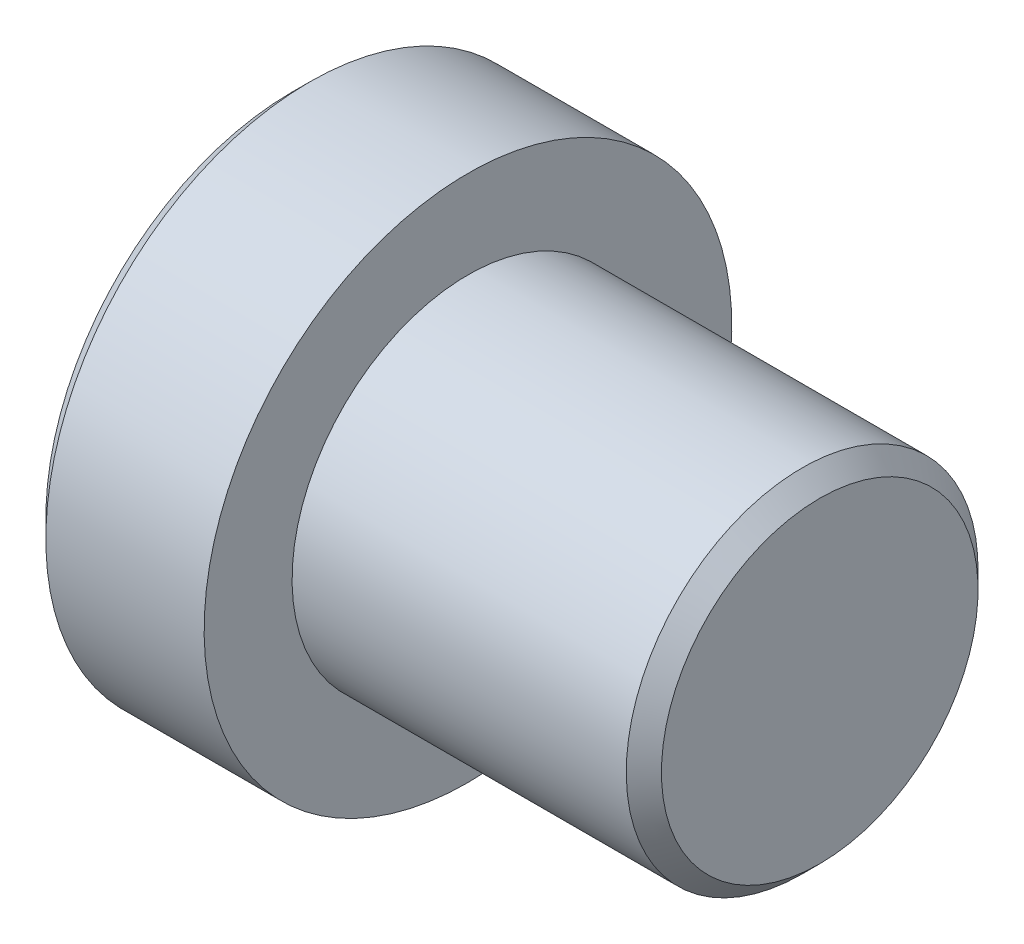
ISO-10303-21;
HEADER;
FILE_DESCRIPTION(('STEP AP214'),'2;1');
FILE_NAME('part.step','',(''),(''),'','','');
FILE_SCHEMA(('AUTOMOTIVE_DESIGN { 1 0 10303 214 1 1 1 1 }'));
ENDSEC;
DATA;
#1=APPLICATION_CONTEXT('core data for automotive mechanical design processes');
#2=APPLICATION_PROTOCOL_DEFINITION('international standard','automotive_design',2000,#1);
#3=PRODUCT_CONTEXT('',#1,'mechanical');
#4=PRODUCT('Part','Part','',(#3));
#5=PRODUCT_RELATED_PRODUCT_CATEGORY('part','',(#4));
#6=PRODUCT_DEFINITION_FORMATION('','',#4);
#7=PRODUCT_DEFINITION_CONTEXT('part definition',#1,'design');
#8=PRODUCT_DEFINITION('design','',#6,#7);
#9=PRODUCT_DEFINITION_SHAPE('','',#8);
#10=(LENGTH_UNIT() NAMED_UNIT(*) SI_UNIT(.MILLI.,.METRE.));
#11=(NAMED_UNIT(*) PLANE_ANGLE_UNIT() SI_UNIT($,.RADIAN.));
#12=(NAMED_UNIT(*) SI_UNIT($,.STERADIAN.) SOLID_ANGLE_UNIT());
#13=UNCERTAINTY_MEASURE_WITH_UNIT(LENGTH_MEASURE(1.E-05),#10,'distance_accuracy_value','');
#14=(GEOMETRIC_REPRESENTATION_CONTEXT(3) GLOBAL_UNCERTAINTY_ASSIGNED_CONTEXT((#13)) GLOBAL_UNIT_ASSIGNED_CONTEXT((#10,
#11,#12)) REPRESENTATION_CONTEXT('',''));
#15=CARTESIAN_POINT('',(0.,0.,0.));
#16=DIRECTION('',(0.,0.,1.));
#17=DIRECTION('',(1.,0.,0.));
#18=AXIS2_PLACEMENT_3D('',#15,#16,#17);
#19=CARTESIAN_POINT('',(0.,0.,0.));
#20=DIRECTION('',(1.,0.,0.));
#21=DIRECTION('',(0.,1.,0.));
#22=AXIS2_PLACEMENT_3D('',#19,#20,#21);
#23=PLANE('',#22);
#24=CARTESIAN_POINT('',(0.,0.,0.));
#25=DIRECTION('',(1.,0.,0.));
#26=DIRECTION('',(0.,1.,0.));
#27=AXIS2_PLACEMENT_3D('',#24,#25,#26);
#28=CIRCLE('',#27,2.8);
#29=CARTESIAN_POINT('',(0.,2.8,0.));
#30=VERTEX_POINT('',#29);
#31=EDGE_CURVE('E58',#30,#30,#28,.F.);
#32=ORIENTED_EDGE('',*,*,#31,.T.);
#33=EDGE_LOOP('',(#32));
#34=FACE_BOUND('',#33,.T.);
#35=DIRECTION('',(0.,-0.5,-0.866025403784439));
#36=VECTOR('',#35,1.);
#37=CARTESIAN_POINT('',(0.,2.,0.));
#38=LINE('',#37,#36);
#39=CARTESIAN_POINT('',(0.,2.,0.));
#40=VERTEX_POINT('',#39);
#41=CARTESIAN_POINT('',(0.,0.999999999999999,-1.73205080756888));
#42=VERTEX_POINT('',#41);
#43=EDGE_CURVE('E139',#40,#42,#38,.T.);
#44=ORIENTED_EDGE('',*,*,#43,.F.);
#45=DIRECTION('',(0.,0.5,-0.866025403784439));
#46=VECTOR('',#45,1.);
#47=CARTESIAN_POINT('',(0.,1.,1.73205080756887));
#48=LINE('',#47,#46);
#49=CARTESIAN_POINT('',(0.,1.,1.73205080756887));
#50=VERTEX_POINT('',#49);
#51=EDGE_CURVE('E65',#50,#40,#48,.T.);
#52=ORIENTED_EDGE('',*,*,#51,.F.);
#53=DIRECTION('',(0.,1.,0.));
#54=VECTOR('',#53,1.);
#55=CARTESIAN_POINT('',(0.,-0.999999999999999,1.73205080756887));
#56=LINE('',#55,#54);
#57=CARTESIAN_POINT('',(0.,-0.999999999999999,1.73205080756887));
#58=VERTEX_POINT('',#57);
#59=EDGE_CURVE('E148',#58,#50,#56,.T.);
#60=ORIENTED_EDGE('',*,*,#59,.F.);
#61=DIRECTION('',(0.,0.5,0.866025403784439));
#62=VECTOR('',#61,1.);
#63=CARTESIAN_POINT('',(0.,-2.,0.));
#64=LINE('',#63,#62);
#65=CARTESIAN_POINT('',(0.,-2.,0.));
#66=VERTEX_POINT('',#65);
#67=EDGE_CURVE('E146',#66,#58,#64,.T.);
#68=ORIENTED_EDGE('',*,*,#67,.F.);
#69=DIRECTION('',(0.,-0.5,0.866025403784439));
#70=VECTOR('',#69,1.);
#71=CARTESIAN_POINT('',(0.,-0.999999999999999,-1.73205080756888));
#72=LINE('',#71,#70);
#73=CARTESIAN_POINT('',(0.,-0.999999999999999,-1.73205080756888));
#74=VERTEX_POINT('',#73);
#75=EDGE_CURVE('E113',#74,#66,#72,.T.);
#76=ORIENTED_EDGE('',*,*,#75,.F.);
#77=DIRECTION('',(0.,-1.,0.));
#78=VECTOR('',#77,1.);
#79=CARTESIAN_POINT('',(0.,0.999999999999999,-1.73205080756888));
#80=LINE('',#79,#78);
#81=EDGE_CURVE('E142',#42,#74,#80,.T.);
#82=ORIENTED_EDGE('',*,*,#81,.F.);
#83=EDGE_LOOP('',(#44,#52,#60,#68,#76,#82));
#84=FACE_BOUND('',#83,.T.);
#85=ADVANCED_FACE('F49',(#34,#84),#23,.F.);
#86=CARTESIAN_POINT('',(0.,0.,0.));
#87=DIRECTION('',(-1.,0.,0.));
#88=DIRECTION('',(0.,-1.,0.));
#89=AXIS2_PLACEMENT_3D('',#86,#87,#88);
#90=CYLINDRICAL_SURFACE('',#89,3.);
#91=CARTESIAN_POINT('',(0.199999999999999,0.,0.));
#92=DIRECTION('',(1.,0.,0.));
#93=DIRECTION('',(0.,1.,0.));
#94=AXIS2_PLACEMENT_3D('',#91,#92,#93);
#95=CIRCLE('',#94,3.);
#96=CARTESIAN_POINT('',(0.199999999999999,3.,0.));
#97=VERTEX_POINT('',#96);
#98=EDGE_CURVE('E11',#97,#97,#95,.T.);
#99=ORIENTED_EDGE('',*,*,#98,.T.);
#100=EDGE_LOOP('',(#99));
#101=FACE_BOUND('',#100,.T.);
#102=CARTESIAN_POINT('',(2.,0.,0.));
#103=DIRECTION('',(-1.,0.,0.));
#104=DIRECTION('',(0.,-1.,0.));
#105=AXIS2_PLACEMENT_3D('',#102,#103,#104);
#106=CIRCLE('',#105,3.);
#107=CARTESIAN_POINT('',(2.,-3.,0.));
#108=VERTEX_POINT('',#107);
#109=EDGE_CURVE('E160',#108,#108,#106,.T.);
#110=ORIENTED_EDGE('',*,*,#109,.T.);
#111=EDGE_LOOP('',(#110));
#112=FACE_BOUND('',#111,.T.);
#113=ADVANCED_FACE('F183',(#101,#112),#90,.T.);
#114=CARTESIAN_POINT('',(2.,3.,0.));
#115=DIRECTION('',(-1.,0.,0.));
#116=DIRECTION('',(0.,-1.,0.));
#117=AXIS2_PLACEMENT_3D('',#114,#115,#116);
#118=PLANE('',#117);
#119=ORIENTED_EDGE('',*,*,#109,.F.);
#120=EDGE_LOOP('',(#119));
#121=FACE_BOUND('',#120,.T.);
#122=CARTESIAN_POINT('',(2.,0.,0.));
#123=DIRECTION('',(-1.,0.,0.));
#124=DIRECTION('',(0.,-1.,0.));
#125=AXIS2_PLACEMENT_3D('',#122,#123,#124);
#126=CIRCLE('',#125,2.);
#127=CARTESIAN_POINT('',(2.,-2.,0.));
#128=VERTEX_POINT('',#127);
#129=EDGE_CURVE('E152',#128,#128,#126,.T.);
#130=ORIENTED_EDGE('',*,*,#129,.T.);
#131=EDGE_LOOP('',(#130));
#132=FACE_BOUND('',#131,.T.);
#133=ADVANCED_FACE('F190',(#121,#132),#118,.F.);
#134=CARTESIAN_POINT('',(0.,0.,0.));
#135=DIRECTION('',(-1.,0.,0.));
#136=DIRECTION('',(0.,-1.,0.));
#137=AXIS2_PLACEMENT_3D('',#134,#135,#136);
#138=CYLINDRICAL_SURFACE('',#137,2.);
#139=CARTESIAN_POINT('',(5.8,0.,0.));
#140=DIRECTION('',(-1.,0.,0.));
#141=DIRECTION('',(0.,-1.,0.));
#142=AXIS2_PLACEMENT_3D('',#139,#140,#141);
#143=CIRCLE('',#142,2.);
#144=CARTESIAN_POINT('',(5.8,-2.,0.));
#145=VERTEX_POINT('',#144);
#146=EDGE_CURVE('E163',#145,#145,#143,.T.);
#147=ORIENTED_EDGE('',*,*,#146,.T.);
#148=EDGE_LOOP('',(#147));
#149=FACE_BOUND('',#148,.T.);
#150=ORIENTED_EDGE('',*,*,#129,.F.);
#151=EDGE_LOOP('',(#150));
#152=FACE_BOUND('',#151,.T.);
#153=ADVANCED_FACE('F201',(#149,#152),#138,.T.);
#154=CARTESIAN_POINT('',(6.,2.,0.));
#155=DIRECTION('',(-1.,0.,0.));
#156=DIRECTION('',(0.,-1.,0.));
#157=AXIS2_PLACEMENT_3D('',#154,#155,#156);
#158=PLANE('',#157);
#159=CARTESIAN_POINT('',(6.,0.,0.));
#160=DIRECTION('',(-1.,0.,0.));
#161=DIRECTION('',(0.,-1.,0.));
#162=AXIS2_PLACEMENT_3D('',#159,#160,#161);
#163=CIRCLE('',#162,1.8);
#164=CARTESIAN_POINT('',(6.,-1.8,0.));
#165=VERTEX_POINT('',#164);
#166=EDGE_CURVE('E166',#165,#165,#163,.F.);
#167=ORIENTED_EDGE('',*,*,#166,.T.);
#168=EDGE_LOOP('',(#167));
#169=FACE_BOUND('',#168,.T.);
#170=ADVANCED_FACE('F205',(#169),#158,.F.);
#171=CARTESIAN_POINT('',(1.5,1.,1.73205080756887));
#172=DIRECTION('',(0.,0.866025403784439,0.5));
#173=DIRECTION('',(0.,-0.5,0.866025403784439));
#174=AXIS2_PLACEMENT_3D('',#171,#172,#173);
#175=PLANE('',#174);
#176=ORIENTED_EDGE('',*,*,#51,.T.);
#177=DIRECTION('',(-1.,0.,0.));
#178=VECTOR('',#177,1.);
#179=CARTESIAN_POINT('',(1.5,2.,0.));
#180=LINE('',#179,#178);
#181=CARTESIAN_POINT('',(1.5,2.,0.));
#182=VERTEX_POINT('',#181);
#183=EDGE_CURVE('E95',#182,#40,#180,.T.);
#184=ORIENTED_EDGE('',*,*,#183,.F.);
#185=DIRECTION('',(0.,0.5,-0.866025403784439));
#186=VECTOR('',#185,1.);
#187=CARTESIAN_POINT('',(1.5,1.,1.73205080756887));
#188=LINE('',#187,#186);
#189=CARTESIAN_POINT('',(1.5,1.,1.73205080756887));
#190=VERTEX_POINT('',#189);
#191=EDGE_CURVE('E150',#190,#182,#188,.T.);
#192=ORIENTED_EDGE('',*,*,#191,.F.);
#193=DIRECTION('',(-1.,0.,0.));
#194=VECTOR('',#193,1.);
#195=CARTESIAN_POINT('',(1.5,1.,1.73205080756887));
#196=LINE('',#195,#194);
#197=EDGE_CURVE('E73',#190,#50,#196,.T.);
#198=ORIENTED_EDGE('',*,*,#197,.T.);
#199=EDGE_LOOP('',(#176,#184,#192,#198));
#200=FACE_BOUND('',#199,.T.);
#201=ADVANCED_FACE('F209',(#200),#175,.F.);
#202=CARTESIAN_POINT('',(1.5,-0.999999999999999,1.73205080756887));
#203=DIRECTION('',(0.,0.,1.));
#204=DIRECTION('',(0.,-1.,0.));
#205=AXIS2_PLACEMENT_3D('',#202,#203,#204);
#206=PLANE('',#205);
#207=ORIENTED_EDGE('',*,*,#59,.T.);
#208=ORIENTED_EDGE('',*,*,#197,.F.);
#209=DIRECTION('',(0.,1.,0.));
#210=VECTOR('',#209,1.);
#211=CARTESIAN_POINT('',(1.5,-0.999999999999999,1.73205080756887));
#212=LINE('',#211,#210);
#213=CARTESIAN_POINT('',(1.5,-0.999999999999999,1.73205080756887));
#214=VERTEX_POINT('',#213);
#215=EDGE_CURVE('E125',#214,#190,#212,.T.);
#216=ORIENTED_EDGE('',*,*,#215,.F.);
#217=DIRECTION('',(-1.,0.,0.));
#218=VECTOR('',#217,1.);
#219=CARTESIAN_POINT('',(1.5,-0.999999999999999,1.73205080756887));
#220=LINE('',#219,#218);
#221=EDGE_CURVE('E117',#214,#58,#220,.T.);
#222=ORIENTED_EDGE('',*,*,#221,.T.);
#223=EDGE_LOOP('',(#207,#208,#216,#222));
#224=FACE_BOUND('',#223,.T.);
#225=ADVANCED_FACE('F213',(#224),#206,.F.);
#226=CARTESIAN_POINT('',(1.5,-2.,0.));
#227=DIRECTION('',(0.,-0.866025403784439,0.5));
#228=DIRECTION('',(0.,-0.5,-0.866025403784439));
#229=AXIS2_PLACEMENT_3D('',#226,#227,#228);
#230=PLANE('',#229);
#231=ORIENTED_EDGE('',*,*,#67,.T.);
#232=ORIENTED_EDGE('',*,*,#221,.F.);
#233=DIRECTION('',(0.,0.5,0.866025403784439));
#234=VECTOR('',#233,1.);
#235=CARTESIAN_POINT('',(1.5,-2.,0.));
#236=LINE('',#235,#234);
#237=CARTESIAN_POINT('',(1.5,-2.,0.));
#238=VERTEX_POINT('',#237);
#239=EDGE_CURVE('E121',#238,#214,#236,.T.);
#240=ORIENTED_EDGE('',*,*,#239,.F.);
#241=DIRECTION('',(-1.,0.,0.));
#242=VECTOR('',#241,1.);
#243=CARTESIAN_POINT('',(1.5,-2.,0.));
#244=LINE('',#243,#242);
#245=EDGE_CURVE('E106',#238,#66,#244,.T.);
#246=ORIENTED_EDGE('',*,*,#245,.T.);
#247=EDGE_LOOP('',(#231,#232,#240,#246));
#248=FACE_BOUND('',#247,.T.);
#249=ADVANCED_FACE('F122',(#248),#230,.F.);
#250=CARTESIAN_POINT('',(1.5,-0.999999999999999,-1.73205080756888));
#251=DIRECTION('',(0.,-0.866025403784439,-0.5));
#252=DIRECTION('',(0.,0.5,-0.866025403784439));
#253=AXIS2_PLACEMENT_3D('',#250,#251,#252);
#254=PLANE('',#253);
#255=ORIENTED_EDGE('',*,*,#75,.T.);
#256=ORIENTED_EDGE('',*,*,#245,.F.);
#257=DIRECTION('',(0.,-0.5,0.866025403784439));
#258=VECTOR('',#257,1.);
#259=CARTESIAN_POINT('',(1.5,-0.999999999999999,-1.73205080756888));
#260=LINE('',#259,#258);
#261=CARTESIAN_POINT('',(1.5,-0.999999999999999,-1.73205080756888));
#262=VERTEX_POINT('',#261);
#263=EDGE_CURVE('E110',#262,#238,#260,.T.);
#264=ORIENTED_EDGE('',*,*,#263,.F.);
#265=DIRECTION('',(-1.,0.,0.));
#266=VECTOR('',#265,1.);
#267=CARTESIAN_POINT('',(1.5,-0.999999999999999,-1.73205080756888));
#268=LINE('',#267,#266);
#269=EDGE_CURVE('E118',#262,#74,#268,.T.);
#270=ORIENTED_EDGE('',*,*,#269,.T.);
#271=EDGE_LOOP('',(#255,#256,#264,#270));
#272=FACE_BOUND('',#271,.T.);
#273=ADVANCED_FACE('F108',(#272),#254,.F.);
#274=CARTESIAN_POINT('',(1.5,0.999999999999999,-1.73205080756888));
#275=DIRECTION('',(0.,0.,-1.));
#276=DIRECTION('',(0.,1.,0.));
#277=AXIS2_PLACEMENT_3D('',#274,#275,#276);
#278=PLANE('',#277);
#279=ORIENTED_EDGE('',*,*,#81,.T.);
#280=ORIENTED_EDGE('',*,*,#269,.F.);
#281=DIRECTION('',(0.,-1.,0.));
#282=VECTOR('',#281,1.);
#283=CARTESIAN_POINT('',(1.5,0.999999999999999,-1.73205080756888));
#284=LINE('',#283,#282);
#285=CARTESIAN_POINT('',(1.5,0.999999999999999,-1.73205080756888));
#286=VERTEX_POINT('',#285);
#287=EDGE_CURVE('E131',#286,#262,#284,.T.);
#288=ORIENTED_EDGE('',*,*,#287,.F.);
#289=DIRECTION('',(-1.,0.,0.));
#290=VECTOR('',#289,1.);
#291=CARTESIAN_POINT('',(1.5,0.999999999999999,-1.73205080756888));
#292=LINE('',#291,#290);
#293=EDGE_CURVE('E155',#286,#42,#292,.T.);
#294=ORIENTED_EDGE('',*,*,#293,.T.);
#295=EDGE_LOOP('',(#279,#280,#288,#294));
#296=FACE_BOUND('',#295,.T.);
#297=ADVANCED_FACE('F217',(#296),#278,.F.);
#298=CARTESIAN_POINT('',(1.5,2.,0.));
#299=DIRECTION('',(0.,0.866025403784439,-0.5));
#300=DIRECTION('',(0.,0.5,0.866025403784439));
#301=AXIS2_PLACEMENT_3D('',#298,#299,#300);
#302=PLANE('',#301);
#303=ORIENTED_EDGE('',*,*,#43,.T.);
#304=ORIENTED_EDGE('',*,*,#293,.F.);
#305=DIRECTION('',(0.,-0.5,-0.866025403784439));
#306=VECTOR('',#305,1.);
#307=CARTESIAN_POINT('',(1.5,2.,0.));
#308=LINE('',#307,#306);
#309=EDGE_CURVE('E133',#182,#286,#308,.T.);
#310=ORIENTED_EDGE('',*,*,#309,.F.);
#311=ORIENTED_EDGE('',*,*,#183,.T.);
#312=EDGE_LOOP('',(#303,#304,#310,#311));
#313=FACE_BOUND('',#312,.T.);
#314=ADVANCED_FACE('F214',(#313),#302,.F.);
#315=CARTESIAN_POINT('',(1.5,0.,0.));
#316=DIRECTION('',(-1.,0.,0.));
#317=DIRECTION('',(0.,-1.,0.));
#318=AXIS2_PLACEMENT_3D('',#315,#316,#317);
#319=PLANE('',#318);
#320=ORIENTED_EDGE('',*,*,#191,.T.);
#321=ORIENTED_EDGE('',*,*,#309,.T.);
#322=ORIENTED_EDGE('',*,*,#287,.T.);
#323=ORIENTED_EDGE('',*,*,#263,.T.);
#324=ORIENTED_EDGE('',*,*,#239,.T.);
#325=ORIENTED_EDGE('',*,*,#215,.T.);
#326=EDGE_LOOP('',(#320,#321,#322,#323,#324,#325));
#327=FACE_BOUND('',#326,.T.);
#328=ADVANCED_FACE('F128',(#327),#319,.T.);
#329=CARTESIAN_POINT('',(5.8,0.,0.));
#330=DIRECTION('',(-1.,0.,0.));
#331=DIRECTION('',(0.,-1.,0.));
#332=AXIS2_PLACEMENT_3D('',#329,#330,#331);
#333=CONICAL_SURFACE('',#332,2.,0.785398163397453);
#334=ORIENTED_EDGE('',*,*,#166,.F.);
#335=EDGE_LOOP('',(#334));
#336=FACE_BOUND('',#335,.T.);
#337=ORIENTED_EDGE('',*,*,#146,.F.);
#338=EDGE_LOOP('',(#337));
#339=FACE_BOUND('',#338,.T.);
#340=ADVANCED_FACE('F174',(#336,#339),#333,.T.);
#341=CARTESIAN_POINT('',(0.,0.,0.));
#342=DIRECTION('',(1.,0.,0.));
#343=DIRECTION('',(0.,1.,0.));
#344=AXIS2_PLACEMENT_3D('',#341,#342,#343);
#345=CONICAL_SURFACE('',#344,2.8,0.785398163397445);
#346=CARTESIAN_POINT('',(0.199999999999999,3.,0.));
#347=CARTESIAN_POINT('',(0.197916666666666,2.99791666666667,0.));
#348=CARTESIAN_POINT('',(0.195833333333332,2.99583333333333,0.));
#349=CARTESIAN_POINT('',(0.191666666666666,2.99166666666667,0.));
#350=CARTESIAN_POINT('',(0.189583333333333,2.98958333333333,0.));
#351=CARTESIAN_POINT('',(0.185416666666666,2.98541666666667,0.));
#352=CARTESIAN_POINT('',(0.183333333333333,2.98333333333333,0.));
#353=CARTESIAN_POINT('',(0.179166666666666,2.97916666666667,0.));
#354=CARTESIAN_POINT('',(0.177083333333333,2.97708333333333,0.));
#355=CARTESIAN_POINT('',(0.172916666666666,2.97291666666667,0.));
#356=CARTESIAN_POINT('',(0.170833333333333,2.97083333333333,0.));
#357=CARTESIAN_POINT('',(0.166666666666666,2.96666666666667,0.));
#358=CARTESIAN_POINT('',(0.164583333333333,2.96458333333333,0.));
#359=CARTESIAN_POINT('',(0.160416666666666,2.96041666666667,0.));
#360=CARTESIAN_POINT('',(0.158333333333333,2.95833333333333,0.));
#361=CARTESIAN_POINT('',(0.154166666666666,2.95416666666667,0.));
#362=CARTESIAN_POINT('',(0.152083333333333,2.95208333333333,0.));
#363=CARTESIAN_POINT('',(0.147916666666666,2.94791666666667,0.));
#364=CARTESIAN_POINT('',(0.145833333333333,2.94583333333333,0.));
#365=CARTESIAN_POINT('',(0.141666666666666,2.94166666666667,0.));
#366=CARTESIAN_POINT('',(0.139583333333333,2.93958333333333,0.));
#367=CARTESIAN_POINT('',(0.135416666666666,2.93541666666667,0.));
#368=CARTESIAN_POINT('',(0.133333333333333,2.93333333333333,0.));
#369=CARTESIAN_POINT('',(0.129166666666666,2.92916666666667,0.));
#370=CARTESIAN_POINT('',(0.127083333333333,2.92708333333333,0.));
#371=CARTESIAN_POINT('',(0.122916666666666,2.92291666666667,0.));
#372=CARTESIAN_POINT('',(0.120833333333333,2.92083333333333,0.));
#373=CARTESIAN_POINT('',(0.116666666666666,2.91666666666667,0.));
#374=CARTESIAN_POINT('',(0.114583333333333,2.91458333333333,0.));
#375=CARTESIAN_POINT('',(0.110416666666666,2.91041666666667,0.));
#376=CARTESIAN_POINT('',(0.108333333333333,2.90833333333333,0.));
#377=CARTESIAN_POINT('',(0.104166666666666,2.90416666666667,0.));
#378=CARTESIAN_POINT('',(0.102083333333333,2.90208333333333,0.));
#379=CARTESIAN_POINT('',(0.0979166666666663,2.89791666666667,0.));
#380=CARTESIAN_POINT('',(0.0958333333333329,2.89583333333333,0.));
#381=CARTESIAN_POINT('',(0.0916666666666663,2.89166666666667,0.));
#382=CARTESIAN_POINT('',(0.089583333333333,2.88958333333333,0.));
#383=CARTESIAN_POINT('',(0.0854166666666664,2.88541666666667,0.));
#384=CARTESIAN_POINT('',(0.083333333333333,2.88333333333333,0.));
#385=CARTESIAN_POINT('',(0.0791666666666663,2.87916666666667,0.));
#386=CARTESIAN_POINT('',(0.0770833333333331,2.87708333333333,0.));
#387=CARTESIAN_POINT('',(0.0729166666666664,2.87291666666667,0.));
#388=CARTESIAN_POINT('',(0.070833333333333,2.87083333333333,0.));
#389=CARTESIAN_POINT('',(0.0666666666666664,2.86666666666667,0.));
#390=CARTESIAN_POINT('',(0.0645833333333331,2.86458333333333,0.));
#391=CARTESIAN_POINT('',(0.0604166666666665,2.86041666666667,0.));
#392=CARTESIAN_POINT('',(0.0583333333333331,2.85833333333333,0.));
#393=CARTESIAN_POINT('',(0.0541666666666664,2.85416666666667,0.));
#394=CARTESIAN_POINT('',(0.0520833333333331,2.85208333333334,0.));
#395=CARTESIAN_POINT('',(0.0479166666666665,2.84791666666667,0.));
#396=CARTESIAN_POINT('',(0.0458333333333332,2.84583333333333,0.));
#397=CARTESIAN_POINT('',(0.0416666666666665,2.84166666666667,0.));
#398=CARTESIAN_POINT('',(0.0395833333333331,2.83958333333333,0.));
#399=CARTESIAN_POINT('',(0.0354166666666665,2.83541666666667,0.));
#400=CARTESIAN_POINT('',(0.0333333333333332,2.83333333333334,0.));
#401=CARTESIAN_POINT('',(0.0291666666666666,2.82916666666667,0.));
#402=CARTESIAN_POINT('',(0.0270833333333332,2.82708333333334,0.));
#403=CARTESIAN_POINT('',(0.0229166666666665,2.82291666666667,0.));
#404=CARTESIAN_POINT('',(0.0208333333333333,2.82083333333334,0.));
#405=CARTESIAN_POINT('',(0.0166666666666666,2.81666666666667,0.));
#406=CARTESIAN_POINT('',(0.0145833333333333,2.81458333333333,0.));
#407=CARTESIAN_POINT('',(0.0104166666666666,2.81041666666667,0.));
#408=CARTESIAN_POINT('',(0.0083333333333333,2.80833333333334,0.));
#409=CARTESIAN_POINT('',(0.00416666666666674,2.80416666666667,0.));
#410=CARTESIAN_POINT('',(0.00208333333333346,2.80208333333334,0.));
#411=CARTESIAN_POINT('',(0.,2.8,0.));
#412=B_SPLINE_CURVE_WITH_KNOTS('',3,(#346,#347,#348,#349,#350,#351,#352,#353,#354,#355,#356,
#357,#358,#359,#360,#361,#362,#363,#364,#365,#366,#367,#368,#369,#370,#371,#372,#373,#374,#375,
#376,#377,#378,#379,#380,#381,#382,#383,#384,#385,#386,#387,#388,#389,#390,#391,#392,#393,#394,
#395,#396,#397,#398,#399,#400,#401,#402,#403,#404,#405,#406,#407,#408,#409,#410,#411),
.UNSPECIFIED.,.F.,.F.,(4,2,2,2,2,2,2,2,2,2,2,2,2,2,2,2,2,2,2,2,2,2,2,2,2,2,2,2,2,2,2,2,4),(0.,
0.00883883476483166,0.0176776695296636,0.0265165042944953,0.0353553390593272,0.0441941738241589,
0.0530330085889908,0.0618718433538225,0.0707106781186541,0.0795495128834861,0.0883883476483177,
0.0972271824131497,0.106066017177981,0.114904851942813,0.123743686707645,0.132582521472477,
0.141421356237309,0.15026019100214,0.159099025766972,0.167937860531804,0.176776695296636,
0.185615530061467,0.194454364826299,0.203293199591131,0.212132034355963,0.220970869120795,
0.229809703885626,0.238648538650458,0.24748737341529,0.256326208180122,0.265165042944953,
0.274003877709785,0.282842712474617),.UNSPECIFIED.);
#413=EDGE_CURVE('BSEAM52',#97,#30,#412,.T.);
#414=ORIENTED_EDGE('',*,*,#98,.F.);
#415=ORIENTED_EDGE('',*,*,#31,.F.);
#416=ORIENTED_EDGE('',*,*,#413,.T.);
#417=ORIENTED_EDGE('',*,*,#413,.F.);
#418=EDGE_LOOP('',(#414,#416,#415,#417));
#419=FACE_BOUND('',#418,.T.);
#420=ADVANCED_FACE('F52',(#419),#345,.T.);
#421=CLOSED_SHELL('',(#85,#113,#133,#153,#170,#201,#225,#249,#273,#297,#314,#328,#340,#420));
#422=MANIFOLD_SOLID_BREP('B2',#421);
#423=ADVANCED_BREP_SHAPE_REPRESENTATION('',(#18,#422),#14);
#424=SHAPE_DEFINITION_REPRESENTATION(#9,#423);
ENDSEC;
END-ISO-10303-21;
